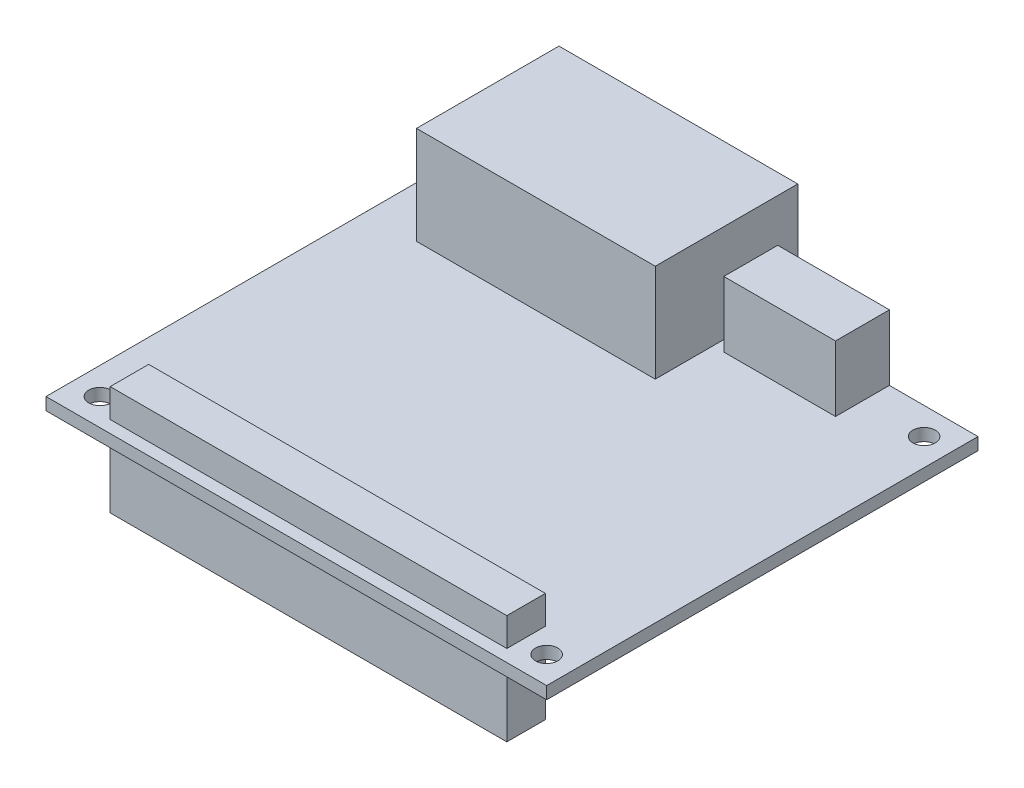
ISO-10303-21;
HEADER;
FILE_DESCRIPTION(('STEP AP214'),'2;1');
FILE_NAME('part.step','',(''),(''),'','','');
FILE_SCHEMA(('AUTOMOTIVE_DESIGN { 1 0 10303 214 1 1 1 1 }'));
ENDSEC;
DATA;
#1=APPLICATION_CONTEXT('core data for automotive mechanical design processes');
#2=APPLICATION_PROTOCOL_DEFINITION('international standard','automotive_design',2000,#1);
#3=PRODUCT_CONTEXT('',#1,'mechanical');
#4=PRODUCT('Part','Part','',(#3));
#5=PRODUCT_RELATED_PRODUCT_CATEGORY('part','',(#4));
#6=PRODUCT_DEFINITION_FORMATION('','',#4);
#7=PRODUCT_DEFINITION_CONTEXT('part definition',#1,'design');
#8=PRODUCT_DEFINITION('design','',#6,#7);
#9=PRODUCT_DEFINITION_SHAPE('','',#8);
#10=(LENGTH_UNIT() NAMED_UNIT(*) SI_UNIT(.MILLI.,.METRE.));
#11=(NAMED_UNIT(*) PLANE_ANGLE_UNIT() SI_UNIT($,.RADIAN.));
#12=(NAMED_UNIT(*) SI_UNIT($,.STERADIAN.) SOLID_ANGLE_UNIT());
#13=UNCERTAINTY_MEASURE_WITH_UNIT(LENGTH_MEASURE(1.E-05),#10,'distance_accuracy_value','');
#14=(GEOMETRIC_REPRESENTATION_CONTEXT(3) GLOBAL_UNCERTAINTY_ASSIGNED_CONTEXT((#13)) GLOBAL_UNIT_ASSIGNED_CONTEXT((#10,
#11,#12)) REPRESENTATION_CONTEXT('',''));
#15=CARTESIAN_POINT('',(0.,0.,0.));
#16=DIRECTION('',(0.,0.,1.));
#17=DIRECTION('',(1.,0.,0.));
#18=AXIS2_PLACEMENT_3D('',#15,#16,#17);
#19=CARTESIAN_POINT('',(-25.75,-8.9,21.4200557958589));
#20=DIRECTION('',(-1.,0.,0.));
#21=DIRECTION('',(0.,0.,1.));
#22=AXIS2_PLACEMENT_3D('',#19,#20,#21);
#23=PLANE('',#22);
#24=DIRECTION('',(0.,1.,0.));
#25=VECTOR('',#24,1.);
#26=CARTESIAN_POINT('',(-25.75,-8.9,26.4200557958589));
#27=LINE('',#26,#25);
#28=CARTESIAN_POINT('',(-25.75,-8.9,26.4200557958589));
#29=VERTEX_POINT('',#28);
#30=CARTESIAN_POINT('',(-25.75,5.3,26.4200557958589));
#31=VERTEX_POINT('',#30);
#32=EDGE_CURVE('E46',#29,#31,#27,.T.);
#33=ORIENTED_EDGE('',*,*,#32,.T.);
#34=DIRECTION('',(0.,0.,1.));
#35=VECTOR('',#34,1.);
#36=CARTESIAN_POINT('',(-25.75,5.3,21.4200557958589));
#37=LINE('',#36,#35);
#38=CARTESIAN_POINT('',(-25.75,5.3,21.4200557958589));
#39=VERTEX_POINT('',#38);
#40=EDGE_CURVE('E83',#39,#31,#37,.T.);
#41=ORIENTED_EDGE('',*,*,#40,.F.);
#42=DIRECTION('',(0.,1.,0.));
#43=VECTOR('',#42,1.);
#44=CARTESIAN_POINT('',(-25.75,-8.9,21.4200557958589));
#45=LINE('',#44,#43);
#46=CARTESIAN_POINT('',(-25.75,-8.9,21.4200557958589));
#47=VERTEX_POINT('',#46);
#48=EDGE_CURVE('E12',#47,#39,#45,.T.);
#49=ORIENTED_EDGE('',*,*,#48,.F.);
#50=DIRECTION('',(0.,0.,1.));
#51=VECTOR('',#50,1.);
#52=CARTESIAN_POINT('',(-25.75,-8.9,21.4200557958589));
#53=LINE('',#52,#51);
#54=EDGE_CURVE('E84',#47,#29,#53,.T.);
#55=ORIENTED_EDGE('',*,*,#54,.T.);
#56=EDGE_LOOP('',(#33,#41,#49,#55));
#57=FACE_BOUND('',#56,.T.);
#58=ADVANCED_FACE('F43',(#57),#23,.T.);
#59=CARTESIAN_POINT('',(-25.75,-8.9,21.4200557958589));
#60=DIRECTION('',(0.,0.,-1.));
#61=DIRECTION('',(-1.,0.,0.));
#62=AXIS2_PLACEMENT_3D('',#59,#60,#61);
#63=PLANE('',#62);
#64=ORIENTED_EDGE('',*,*,#48,.T.);
#65=DIRECTION('',(-1.,0.,0.));
#66=VECTOR('',#65,1.);
#67=CARTESIAN_POINT('',(-25.75,5.3,21.4200557958589));
#68=LINE('',#67,#66);
#69=CARTESIAN_POINT('',(25.75,5.3,21.4200557958589));
#70=VERTEX_POINT('',#69);
#71=EDGE_CURVE('E100',#70,#39,#68,.T.);
#72=ORIENTED_EDGE('',*,*,#71,.F.);
#73=DIRECTION('',(0.,1.,0.));
#74=VECTOR('',#73,1.);
#75=CARTESIAN_POINT('',(25.75,-8.9,21.4200557958589));
#76=LINE('',#75,#74);
#77=CARTESIAN_POINT('',(25.75,-8.9,21.4200557958589));
#78=VERTEX_POINT('',#77);
#79=EDGE_CURVE('E51',#78,#70,#76,.T.);
#80=ORIENTED_EDGE('',*,*,#79,.F.);
#81=DIRECTION('',(-1.,0.,0.));
#82=VECTOR('',#81,1.);
#83=CARTESIAN_POINT('',(-25.75,-8.9,21.4200557958589));
#84=LINE('',#83,#82);
#85=EDGE_CURVE('E89',#78,#47,#84,.T.);
#86=ORIENTED_EDGE('',*,*,#85,.T.);
#87=EDGE_LOOP('',(#64,#72,#80,#86));
#88=FACE_BOUND('',#87,.T.);
#89=ADVANCED_FACE('F115',(#88),#63,.T.);
#90=CARTESIAN_POINT('',(25.75,-8.9,21.4200557958589));
#91=DIRECTION('',(1.,0.,0.));
#92=DIRECTION('',(0.,0.,-1.));
#93=AXIS2_PLACEMENT_3D('',#90,#91,#92);
#94=PLANE('',#93);
#95=ORIENTED_EDGE('',*,*,#79,.T.);
#96=DIRECTION('',(0.,0.,-1.));
#97=VECTOR('',#96,1.);
#98=CARTESIAN_POINT('',(25.75,5.3,21.4200557958589));
#99=LINE('',#98,#97);
#100=CARTESIAN_POINT('',(25.75,5.3,26.4200557958589));
#101=VERTEX_POINT('',#100);
#102=EDGE_CURVE('E96',#101,#70,#99,.T.);
#103=ORIENTED_EDGE('',*,*,#102,.F.);
#104=DIRECTION('',(0.,1.,0.));
#105=VECTOR('',#104,1.);
#106=CARTESIAN_POINT('',(25.75,-8.9,26.4200557958589));
#107=LINE('',#106,#105);
#108=CARTESIAN_POINT('',(25.75,-8.9,26.4200557958589));
#109=VERTEX_POINT('',#108);
#110=EDGE_CURVE('E88',#109,#101,#107,.T.);
#111=ORIENTED_EDGE('',*,*,#110,.F.);
#112=DIRECTION('',(0.,0.,-1.));
#113=VECTOR('',#112,1.);
#114=CARTESIAN_POINT('',(25.75,-8.9,21.4200557958589));
#115=LINE('',#114,#113);
#116=EDGE_CURVE('E108',#109,#78,#115,.T.);
#117=ORIENTED_EDGE('',*,*,#116,.T.);
#118=EDGE_LOOP('',(#95,#103,#111,#117));
#119=FACE_BOUND('',#118,.T.);
#120=ADVANCED_FACE('F112',(#119),#94,.T.);
#121=CARTESIAN_POINT('',(-25.75,-8.9,26.4200557958589));
#122=DIRECTION('',(0.,0.,1.));
#123=DIRECTION('',(1.,0.,0.));
#124=AXIS2_PLACEMENT_3D('',#121,#122,#123);
#125=PLANE('',#124);
#126=ORIENTED_EDGE('',*,*,#110,.T.);
#127=DIRECTION('',(1.,0.,0.));
#128=VECTOR('',#127,1.);
#129=CARTESIAN_POINT('',(-25.75,5.3,26.4200557958589));
#130=LINE('',#129,#128);
#131=EDGE_CURVE('E91',#31,#101,#130,.T.);
#132=ORIENTED_EDGE('',*,*,#131,.F.);
#133=ORIENTED_EDGE('',*,*,#32,.F.);
#134=DIRECTION('',(1.,0.,0.));
#135=VECTOR('',#134,1.);
#136=CARTESIAN_POINT('',(-25.75,-8.9,26.4200557958589));
#137=LINE('',#136,#135);
#138=EDGE_CURVE('E106',#29,#109,#137,.T.);
#139=ORIENTED_EDGE('',*,*,#138,.T.);
#140=EDGE_LOOP('',(#126,#132,#133,#139));
#141=FACE_BOUND('',#140,.T.);
#142=ADVANCED_FACE('F92',(#141),#125,.T.);
#143=CARTESIAN_POINT('',(0.,-8.9,0.));
#144=DIRECTION('',(0.,1.,0.));
#145=DIRECTION('',(0.,0.,1.));
#146=AXIS2_PLACEMENT_3D('',#143,#144,#145);
#147=PLANE('',#146);
#148=ORIENTED_EDGE('',*,*,#54,.F.);
#149=ORIENTED_EDGE('',*,*,#85,.F.);
#150=ORIENTED_EDGE('',*,*,#116,.F.);
#151=ORIENTED_EDGE('',*,*,#138,.F.);
#152=EDGE_LOOP('',(#148,#149,#150,#151));
#153=FACE_BOUND('',#152,.T.);
#154=ADVANCED_FACE('F117',(#153),#147,.F.);
#155=CARTESIAN_POINT('',(0.,5.3,0.));
#156=DIRECTION('',(0.,1.,0.));
#157=DIRECTION('',(0.,0.,1.));
#158=AXIS2_PLACEMENT_3D('',#155,#156,#157);
#159=PLANE('',#158);
#160=ORIENTED_EDGE('',*,*,#40,.T.);
#161=ORIENTED_EDGE('',*,*,#131,.T.);
#162=ORIENTED_EDGE('',*,*,#102,.T.);
#163=ORIENTED_EDGE('',*,*,#71,.T.);
#164=EDGE_LOOP('',(#160,#161,#162,#163));
#165=FACE_BOUND('',#164,.T.);
#166=ADVANCED_FACE('F99',(#165),#159,.T.);
#167=CLOSED_SHELL('',(#58,#89,#120,#142,#154,#166));
#168=MANIFOLD_SOLID_BREP('B2',#167);
#169=CARTESIAN_POINT('',(6.49999999999999,10.1,-28.));
#170=DIRECTION('',(1.,0.,0.));
#171=DIRECTION('',(0.,0.,-1.));
#172=AXIS2_PLACEMENT_3D('',#169,#170,#171);
#173=PLANE('',#172);
#174=DIRECTION('',(0.,0.,1.));
#175=VECTOR('',#174,1.);
#176=CARTESIAN_POINT('',(6.49999999999999,1.6,-28.));
#177=LINE('',#176,#175);
#178=CARTESIAN_POINT('',(6.49999999999999,1.6,-28.));
#179=VERTEX_POINT('',#178);
#180=CARTESIAN_POINT('',(6.49999999999999,1.6,-21.));
#181=VERTEX_POINT('',#180);
#182=EDGE_CURVE('E239',#179,#181,#177,.T.);
#183=ORIENTED_EDGE('',*,*,#182,.T.);
#184=DIRECTION('',(0.,-1.,0.));
#185=VECTOR('',#184,1.);
#186=CARTESIAN_POINT('',(6.49999999999999,10.1,-21.));
#187=LINE('',#186,#185);
#188=CARTESIAN_POINT('',(6.49999999999999,10.1,-21.));
#189=VERTEX_POINT('',#188);
#190=EDGE_CURVE('E41',#189,#181,#187,.T.);
#191=ORIENTED_EDGE('',*,*,#190,.F.);
#192=DIRECTION('',(0.,0.,1.));
#193=VECTOR('',#192,1.);
#194=CARTESIAN_POINT('',(6.49999999999999,10.1,-28.));
#195=LINE('',#194,#193);
#196=CARTESIAN_POINT('',(6.49999999999999,10.1,-28.));
#197=VERTEX_POINT('',#196);
#198=EDGE_CURVE('E227',#197,#189,#195,.T.);
#199=ORIENTED_EDGE('',*,*,#198,.F.);
#200=DIRECTION('',(0.,-1.,0.));
#201=VECTOR('',#200,1.);
#202=CARTESIAN_POINT('',(6.49999999999999,10.1,-28.));
#203=LINE('',#202,#201);
#204=EDGE_CURVE('E235',#197,#179,#203,.T.);
#205=ORIENTED_EDGE('',*,*,#204,.T.);
#206=EDGE_LOOP('',(#183,#191,#199,#205));
#207=FACE_BOUND('',#206,.T.);
#208=ADVANCED_FACE('F176',(#207),#173,.F.);
#209=CARTESIAN_POINT('',(6.49999999999999,10.1,-21.));
#210=DIRECTION('',(0.,0.,-1.));
#211=DIRECTION('',(-1.,0.,0.));
#212=AXIS2_PLACEMENT_3D('',#209,#210,#211);
#213=PLANE('',#212);
#214=DIRECTION('',(1.,0.,0.));
#215=VECTOR('',#214,1.);
#216=CARTESIAN_POINT('',(6.49999999999999,1.6,-21.));
#217=LINE('',#216,#215);
#218=CARTESIAN_POINT('',(21.,1.6,-21.));
#219=VERTEX_POINT('',#218);
#220=EDGE_CURVE('E231',#181,#219,#217,.T.);
#221=ORIENTED_EDGE('',*,*,#220,.T.);
#222=DIRECTION('',(0.,-1.,0.));
#223=VECTOR('',#222,1.);
#224=CARTESIAN_POINT('',(21.,10.1,-21.));
#225=LINE('',#224,#223);
#226=CARTESIAN_POINT('',(21.,10.1,-21.));
#227=VERTEX_POINT('',#226);
#228=EDGE_CURVE('E184',#227,#219,#225,.T.);
#229=ORIENTED_EDGE('',*,*,#228,.F.);
#230=DIRECTION('',(1.,0.,0.));
#231=VECTOR('',#230,1.);
#232=CARTESIAN_POINT('',(6.49999999999999,10.1,-21.));
#233=LINE('',#232,#231);
#234=EDGE_CURVE('E222',#189,#227,#233,.T.);
#235=ORIENTED_EDGE('',*,*,#234,.F.);
#236=ORIENTED_EDGE('',*,*,#190,.T.);
#237=EDGE_LOOP('',(#221,#229,#235,#236));
#238=FACE_BOUND('',#237,.T.);
#239=ADVANCED_FACE('F230',(#238),#213,.F.);
#240=CARTESIAN_POINT('',(21.,10.1,-28.));
#241=DIRECTION('',(-1.,0.,0.));
#242=DIRECTION('',(0.,0.,1.));
#243=AXIS2_PLACEMENT_3D('',#240,#241,#242);
#244=PLANE('',#243);
#245=DIRECTION('',(0.,0.,-1.));
#246=VECTOR('',#245,1.);
#247=CARTESIAN_POINT('',(21.,1.6,-28.));
#248=LINE('',#247,#246);
#249=CARTESIAN_POINT('',(21.,1.6,-28.));
#250=VERTEX_POINT('',#249);
#251=EDGE_CURVE('E209',#219,#250,#248,.T.);
#252=ORIENTED_EDGE('',*,*,#251,.T.);
#253=DIRECTION('',(0.,-1.,0.));
#254=VECTOR('',#253,1.);
#255=CARTESIAN_POINT('',(21.,10.1,-28.));
#256=LINE('',#255,#254);
#257=CARTESIAN_POINT('',(21.,10.1,-28.));
#258=VERTEX_POINT('',#257);
#259=EDGE_CURVE('E232',#258,#250,#256,.T.);
#260=ORIENTED_EDGE('',*,*,#259,.F.);
#261=DIRECTION('',(0.,0.,-1.));
#262=VECTOR('',#261,1.);
#263=CARTESIAN_POINT('',(21.,10.1,-28.));
#264=LINE('',#263,#262);
#265=EDGE_CURVE('E225',#227,#258,#264,.T.);
#266=ORIENTED_EDGE('',*,*,#265,.F.);
#267=ORIENTED_EDGE('',*,*,#228,.T.);
#268=EDGE_LOOP('',(#252,#260,#266,#267));
#269=FACE_BOUND('',#268,.T.);
#270=ADVANCED_FACE('F233',(#269),#244,.F.);
#271=CARTESIAN_POINT('',(6.49999999999999,10.1,-28.));
#272=DIRECTION('',(0.,0.,1.));
#273=DIRECTION('',(1.,0.,0.));
#274=AXIS2_PLACEMENT_3D('',#271,#272,#273);
#275=PLANE('',#274);
#276=DIRECTION('',(-1.,0.,0.));
#277=VECTOR('',#276,1.);
#278=CARTESIAN_POINT('',(6.49999999999999,1.6,-28.));
#279=LINE('',#278,#277);
#280=EDGE_CURVE('E215',#250,#179,#279,.T.);
#281=ORIENTED_EDGE('',*,*,#280,.T.);
#282=ORIENTED_EDGE('',*,*,#204,.F.);
#283=DIRECTION('',(-1.,0.,0.));
#284=VECTOR('',#283,1.);
#285=CARTESIAN_POINT('',(6.49999999999999,10.1,-28.));
#286=LINE('',#285,#284);
#287=EDGE_CURVE('E192',#258,#197,#286,.T.);
#288=ORIENTED_EDGE('',*,*,#287,.F.);
#289=ORIENTED_EDGE('',*,*,#259,.T.);
#290=EDGE_LOOP('',(#281,#282,#288,#289));
#291=FACE_BOUND('',#290,.T.);
#292=ADVANCED_FACE('F246',(#291),#275,.F.);
#293=CARTESIAN_POINT('',(0.,10.1,0.));
#294=DIRECTION('',(0.,1.,0.));
#295=DIRECTION('',(0.,0.,1.));
#296=AXIS2_PLACEMENT_3D('',#293,#294,#295);
#297=PLANE('',#296);
#298=ORIENTED_EDGE('',*,*,#198,.T.);
#299=ORIENTED_EDGE('',*,*,#234,.T.);
#300=ORIENTED_EDGE('',*,*,#265,.T.);
#301=ORIENTED_EDGE('',*,*,#287,.T.);
#302=EDGE_LOOP('',(#298,#299,#300,#301));
#303=FACE_BOUND('',#302,.T.);
#304=ADVANCED_FACE('F223',(#303),#297,.T.);
#305=CARTESIAN_POINT('',(0.,1.6,0.));
#306=DIRECTION('',(0.,1.,0.));
#307=DIRECTION('',(0.,0.,1.));
#308=AXIS2_PLACEMENT_3D('',#305,#306,#307);
#309=PLANE('',#308);
#310=ORIENTED_EDGE('',*,*,#182,.F.);
#311=ORIENTED_EDGE('',*,*,#280,.F.);
#312=ORIENTED_EDGE('',*,*,#251,.F.);
#313=ORIENTED_EDGE('',*,*,#220,.F.);
#314=EDGE_LOOP('',(#310,#311,#312,#313));
#315=FACE_BOUND('',#314,.T.);
#316=ADVANCED_FACE('F249',(#315),#309,.F.);
#317=CLOSED_SHELL('',(#208,#239,#270,#292,#304,#316));
#318=MANIFOLD_SOLID_BREP('B6',#317);
#319=CARTESIAN_POINT('',(-25.9,14.3,-32.));
#320=DIRECTION('',(1.,0.,0.));
#321=DIRECTION('',(0.,0.,-1.));
#322=AXIS2_PLACEMENT_3D('',#319,#320,#321);
#323=PLANE('',#322);
#324=DIRECTION('',(0.,0.,1.));
#325=VECTOR('',#324,1.);
#326=CARTESIAN_POINT('',(-25.9,1.6,-32.));
#327=LINE('',#326,#325);
#328=CARTESIAN_POINT('',(-25.9,1.6,-32.));
#329=VERTEX_POINT('',#328);
#330=CARTESIAN_POINT('',(-25.9,1.6,-13.5));
#331=VERTEX_POINT('',#330);
#332=EDGE_CURVE('E371',#329,#331,#327,.T.);
#333=ORIENTED_EDGE('',*,*,#332,.T.);
#334=DIRECTION('',(0.,-1.,0.));
#335=VECTOR('',#334,1.);
#336=CARTESIAN_POINT('',(-25.9,14.3,-13.5));
#337=LINE('',#336,#335);
#338=CARTESIAN_POINT('',(-25.9,14.3,-13.5));
#339=VERTEX_POINT('',#338);
#340=EDGE_CURVE('E174',#339,#331,#337,.T.);
#341=ORIENTED_EDGE('',*,*,#340,.F.);
#342=DIRECTION('',(0.,0.,1.));
#343=VECTOR('',#342,1.);
#344=CARTESIAN_POINT('',(-25.9,14.3,-32.));
#345=LINE('',#344,#343);
#346=CARTESIAN_POINT('',(-25.9,14.3,-32.));
#347=VERTEX_POINT('',#346);
#348=EDGE_CURVE('E359',#347,#339,#345,.T.);
#349=ORIENTED_EDGE('',*,*,#348,.F.);
#350=DIRECTION('',(0.,-1.,0.));
#351=VECTOR('',#350,1.);
#352=CARTESIAN_POINT('',(-25.9,14.3,-32.));
#353=LINE('',#352,#351);
#354=EDGE_CURVE('E367',#347,#329,#353,.T.);
#355=ORIENTED_EDGE('',*,*,#354,.T.);
#356=EDGE_LOOP('',(#333,#341,#349,#355));
#357=FACE_BOUND('',#356,.T.);
#358=ADVANCED_FACE('F308',(#357),#323,.F.);
#359=CARTESIAN_POINT('',(-25.9,14.3,-13.5));
#360=DIRECTION('',(0.,0.,-1.));
#361=DIRECTION('',(-1.,0.,0.));
#362=AXIS2_PLACEMENT_3D('',#359,#360,#361);
#363=PLANE('',#362);
#364=DIRECTION('',(1.,0.,0.));
#365=VECTOR('',#364,1.);
#366=CARTESIAN_POINT('',(-25.9,1.6,-13.5));
#367=LINE('',#366,#365);
#368=CARTESIAN_POINT('',(5.1,1.6,-13.5));
#369=VERTEX_POINT('',#368);
#370=EDGE_CURVE('E363',#331,#369,#367,.T.);
#371=ORIENTED_EDGE('',*,*,#370,.T.);
#372=DIRECTION('',(0.,-1.,0.));
#373=VECTOR('',#372,1.);
#374=CARTESIAN_POINT('',(5.1,14.3,-13.5));
#375=LINE('',#374,#373);
#376=CARTESIAN_POINT('',(5.1,14.3,-13.5));
#377=VERTEX_POINT('',#376);
#378=EDGE_CURVE('E316',#377,#369,#375,.T.);
#379=ORIENTED_EDGE('',*,*,#378,.F.);
#380=DIRECTION('',(1.,0.,0.));
#381=VECTOR('',#380,1.);
#382=CARTESIAN_POINT('',(-25.9,14.3,-13.5));
#383=LINE('',#382,#381);
#384=EDGE_CURVE('E354',#339,#377,#383,.T.);
#385=ORIENTED_EDGE('',*,*,#384,.F.);
#386=ORIENTED_EDGE('',*,*,#340,.T.);
#387=EDGE_LOOP('',(#371,#379,#385,#386));
#388=FACE_BOUND('',#387,.T.);
#389=ADVANCED_FACE('F362',(#388),#363,.F.);
#390=CARTESIAN_POINT('',(5.09999999999999,14.3,-32.));
#391=DIRECTION('',(-1.,0.,0.));
#392=DIRECTION('',(0.,0.,1.));
#393=AXIS2_PLACEMENT_3D('',#390,#391,#392);
#394=PLANE('',#393);
#395=DIRECTION('',(0.,0.,-1.));
#396=VECTOR('',#395,1.);
#397=CARTESIAN_POINT('',(5.09999999999999,1.6,-32.));
#398=LINE('',#397,#396);
#399=CARTESIAN_POINT('',(5.09999999999999,1.6,-32.));
#400=VERTEX_POINT('',#399);
#401=EDGE_CURVE('E341',#369,#400,#398,.T.);
#402=ORIENTED_EDGE('',*,*,#401,.T.);
#403=DIRECTION('',(0.,-1.,0.));
#404=VECTOR('',#403,1.);
#405=CARTESIAN_POINT('',(5.09999999999999,14.3,-32.));
#406=LINE('',#405,#404);
#407=CARTESIAN_POINT('',(5.09999999999999,14.3,-32.));
#408=VERTEX_POINT('',#407);
#409=EDGE_CURVE('E364',#408,#400,#406,.T.);
#410=ORIENTED_EDGE('',*,*,#409,.F.);
#411=DIRECTION('',(0.,0.,-1.));
#412=VECTOR('',#411,1.);
#413=CARTESIAN_POINT('',(5.09999999999999,14.3,-32.));
#414=LINE('',#413,#412);
#415=EDGE_CURVE('E357',#377,#408,#414,.T.);
#416=ORIENTED_EDGE('',*,*,#415,.F.);
#417=ORIENTED_EDGE('',*,*,#378,.T.);
#418=EDGE_LOOP('',(#402,#410,#416,#417));
#419=FACE_BOUND('',#418,.T.);
#420=ADVANCED_FACE('F365',(#419),#394,.F.);
#421=CARTESIAN_POINT('',(-25.9,14.3,-32.));
#422=DIRECTION('',(0.,0.,1.));
#423=DIRECTION('',(1.,0.,0.));
#424=AXIS2_PLACEMENT_3D('',#421,#422,#423);
#425=PLANE('',#424);
#426=DIRECTION('',(-1.,0.,0.));
#427=VECTOR('',#426,1.);
#428=CARTESIAN_POINT('',(-25.9,1.6,-32.));
#429=LINE('',#428,#427);
#430=EDGE_CURVE('E347',#400,#329,#429,.T.);
#431=ORIENTED_EDGE('',*,*,#430,.T.);
#432=ORIENTED_EDGE('',*,*,#354,.F.);
#433=DIRECTION('',(-1.,0.,0.));
#434=VECTOR('',#433,1.);
#435=CARTESIAN_POINT('',(-25.9,14.3,-32.));
#436=LINE('',#435,#434);
#437=EDGE_CURVE('E324',#408,#347,#436,.T.);
#438=ORIENTED_EDGE('',*,*,#437,.F.);
#439=ORIENTED_EDGE('',*,*,#409,.T.);
#440=EDGE_LOOP('',(#431,#432,#438,#439));
#441=FACE_BOUND('',#440,.T.);
#442=ADVANCED_FACE('F378',(#441),#425,.F.);
#443=CARTESIAN_POINT('',(0.,14.3,0.));
#444=DIRECTION('',(0.,1.,0.));
#445=DIRECTION('',(0.,0.,1.));
#446=AXIS2_PLACEMENT_3D('',#443,#444,#445);
#447=PLANE('',#446);
#448=ORIENTED_EDGE('',*,*,#348,.T.);
#449=ORIENTED_EDGE('',*,*,#384,.T.);
#450=ORIENTED_EDGE('',*,*,#415,.T.);
#451=ORIENTED_EDGE('',*,*,#437,.T.);
#452=EDGE_LOOP('',(#448,#449,#450,#451));
#453=FACE_BOUND('',#452,.T.);
#454=ADVANCED_FACE('F355',(#453),#447,.T.);
#455=CARTESIAN_POINT('',(0.,1.6,0.));
#456=DIRECTION('',(0.,1.,0.));
#457=DIRECTION('',(0.,0.,1.));
#458=AXIS2_PLACEMENT_3D('',#455,#456,#457);
#459=PLANE('',#458);
#460=ORIENTED_EDGE('',*,*,#332,.F.);
#461=ORIENTED_EDGE('',*,*,#430,.F.);
#462=ORIENTED_EDGE('',*,*,#401,.F.);
#463=ORIENTED_EDGE('',*,*,#370,.F.);
#464=EDGE_LOOP('',(#460,#461,#462,#463));
#465=FACE_BOUND('',#464,.T.);
#466=ADVANCED_FACE('F381',(#465),#459,.F.);
#467=CLOSED_SHELL('',(#358,#389,#420,#442,#454,#466));
#468=MANIFOLD_SOLID_BREP('B35',#467);
#469=CARTESIAN_POINT('',(-32.5,1.6,-28.));
#470=DIRECTION('',(1.,0.,0.));
#471=DIRECTION('',(0.,0.,-1.));
#472=AXIS2_PLACEMENT_3D('',#469,#470,#471);
#473=PLANE('',#472);
#474=DIRECTION('',(0.,0.,1.));
#475=VECTOR('',#474,1.);
#476=CARTESIAN_POINT('',(-32.5,0.,-28.));
#477=LINE('',#476,#475);
#478=CARTESIAN_POINT('',(-32.5,0.,-28.));
#479=VERTEX_POINT('',#478);
#480=CARTESIAN_POINT('',(-32.5,0.,28.));
#481=VERTEX_POINT('',#480);
#482=EDGE_CURVE('E494',#479,#481,#477,.T.);
#483=ORIENTED_EDGE('',*,*,#482,.T.);
#484=DIRECTION('',(0.,-1.,0.));
#485=VECTOR('',#484,1.);
#486=CARTESIAN_POINT('',(-32.5,1.6,28.));
#487=LINE('',#486,#485);
#488=CARTESIAN_POINT('',(-32.5,1.6,28.));
#489=VERTEX_POINT('',#488);
#490=EDGE_CURVE('E306',#489,#481,#487,.T.);
#491=ORIENTED_EDGE('',*,*,#490,.F.);
#492=DIRECTION('',(0.,0.,1.));
#493=VECTOR('',#492,1.);
#494=CARTESIAN_POINT('',(-32.5,1.6,-28.));
#495=LINE('',#494,#493);
#496=CARTESIAN_POINT('',(-32.5,1.6,-28.));
#497=VERTEX_POINT('',#496);
#498=EDGE_CURVE('E482',#497,#489,#495,.T.);
#499=ORIENTED_EDGE('',*,*,#498,.F.);
#500=DIRECTION('',(0.,-1.,0.));
#501=VECTOR('',#500,1.);
#502=CARTESIAN_POINT('',(-32.5,1.6,-28.));
#503=LINE('',#502,#501);
#504=EDGE_CURVE('E490',#497,#479,#503,.T.);
#505=ORIENTED_EDGE('',*,*,#504,.T.);
#506=EDGE_LOOP('',(#483,#491,#499,#505));
#507=FACE_BOUND('',#506,.T.);
#508=ADVANCED_FACE('F431',(#507),#473,.F.);
#509=CARTESIAN_POINT('',(-32.5,1.6,28.));
#510=DIRECTION('',(0.,0.,-1.));
#511=DIRECTION('',(-1.,0.,0.));
#512=AXIS2_PLACEMENT_3D('',#509,#510,#511);
#513=PLANE('',#512);
#514=DIRECTION('',(1.,0.,0.));
#515=VECTOR('',#514,1.);
#516=CARTESIAN_POINT('',(-32.5,0.,28.));
#517=LINE('',#516,#515);
#518=CARTESIAN_POINT('',(32.5,0.,28.));
#519=VERTEX_POINT('',#518);
#520=EDGE_CURVE('E486',#481,#519,#517,.T.);
#521=ORIENTED_EDGE('',*,*,#520,.T.);
#522=DIRECTION('',(0.,-1.,0.));
#523=VECTOR('',#522,1.);
#524=CARTESIAN_POINT('',(32.5,1.6,28.));
#525=LINE('',#524,#523);
#526=CARTESIAN_POINT('',(32.5,1.6,28.));
#527=VERTEX_POINT('',#526);
#528=EDGE_CURVE('E439',#527,#519,#525,.T.);
#529=ORIENTED_EDGE('',*,*,#528,.F.);
#530=DIRECTION('',(1.,0.,0.));
#531=VECTOR('',#530,1.);
#532=CARTESIAN_POINT('',(-32.5,1.6,28.));
#533=LINE('',#532,#531);
#534=EDGE_CURVE('E477',#489,#527,#533,.T.);
#535=ORIENTED_EDGE('',*,*,#534,.F.);
#536=ORIENTED_EDGE('',*,*,#490,.T.);
#537=EDGE_LOOP('',(#521,#529,#535,#536));
#538=FACE_BOUND('',#537,.T.);
#539=ADVANCED_FACE('F485',(#538),#513,.F.);
#540=CARTESIAN_POINT('',(32.5,1.6,-28.));
#541=DIRECTION('',(-1.,0.,0.));
#542=DIRECTION('',(0.,0.,1.));
#543=AXIS2_PLACEMENT_3D('',#540,#541,#542);
#544=PLANE('',#543);
#545=DIRECTION('',(0.,0.,-1.));
#546=VECTOR('',#545,1.);
#547=CARTESIAN_POINT('',(32.5,0.,-28.));
#548=LINE('',#547,#546);
#549=CARTESIAN_POINT('',(32.5,0.,-28.));
#550=VERTEX_POINT('',#549);
#551=EDGE_CURVE('E464',#519,#550,#548,.T.);
#552=ORIENTED_EDGE('',*,*,#551,.T.);
#553=DIRECTION('',(0.,-1.,0.));
#554=VECTOR('',#553,1.);
#555=CARTESIAN_POINT('',(32.5,1.6,-28.));
#556=LINE('',#555,#554);
#557=CARTESIAN_POINT('',(32.5,1.6,-28.));
#558=VERTEX_POINT('',#557);
#559=EDGE_CURVE('E487',#558,#550,#556,.T.);
#560=ORIENTED_EDGE('',*,*,#559,.F.);
#561=DIRECTION('',(0.,0.,-1.));
#562=VECTOR('',#561,1.);
#563=CARTESIAN_POINT('',(32.5,1.6,-28.));
#564=LINE('',#563,#562);
#565=EDGE_CURVE('E480',#527,#558,#564,.T.);
#566=ORIENTED_EDGE('',*,*,#565,.F.);
#567=ORIENTED_EDGE('',*,*,#528,.T.);
#568=EDGE_LOOP('',(#552,#560,#566,#567));
#569=FACE_BOUND('',#568,.T.);
#570=ADVANCED_FACE('F488',(#569),#544,.F.);
#571=CARTESIAN_POINT('',(-32.5,1.6,-28.));
#572=DIRECTION('',(0.,0.,1.));
#573=DIRECTION('',(1.,0.,0.));
#574=AXIS2_PLACEMENT_3D('',#571,#572,#573);
#575=PLANE('',#574);
#576=DIRECTION('',(-1.,0.,0.));
#577=VECTOR('',#576,1.);
#578=CARTESIAN_POINT('',(-32.5,0.,-28.));
#579=LINE('',#578,#577);
#580=EDGE_CURVE('E470',#550,#479,#579,.T.);
#581=ORIENTED_EDGE('',*,*,#580,.T.);
#582=ORIENTED_EDGE('',*,*,#504,.F.);
#583=DIRECTION('',(-1.,0.,0.));
#584=VECTOR('',#583,1.);
#585=CARTESIAN_POINT('',(-32.5,1.6,-28.));
#586=LINE('',#585,#584);
#587=EDGE_CURVE('E447',#558,#497,#586,.T.);
#588=ORIENTED_EDGE('',*,*,#587,.F.);
#589=ORIENTED_EDGE('',*,*,#559,.T.);
#590=EDGE_LOOP('',(#581,#582,#588,#589));
#591=FACE_BOUND('',#590,.T.);
#592=ADVANCED_FACE('F502',(#591),#575,.F.);
#593=CARTESIAN_POINT('',(0.,1.6,0.));
#594=DIRECTION('',(0.,1.,0.));
#595=DIRECTION('',(0.,0.,1.));
#596=AXIS2_PLACEMENT_3D('',#593,#594,#595);
#597=PLANE('',#596);
#598=CARTESIAN_POINT('',(-29.,1.6,-24.5));
#599=DIRECTION('',(0.,1.,0.));
#600=DIRECTION('',(0.,0.,1.));
#601=AXIS2_PLACEMENT_3D('',#598,#599,#600);
#602=CIRCLE('',#601,1.44999999999999);
#603=CARTESIAN_POINT('',(-29.,1.6,-23.05));
#604=VERTEX_POINT('',#603);
#605=EDGE_CURVE('E528',#604,#604,#602,.T.);
#606=ORIENTED_EDGE('',*,*,#605,.F.);
#607=EDGE_LOOP('',(#606));
#608=FACE_BOUND('',#607,.T.);
#609=CARTESIAN_POINT('',(29.,1.6,-24.5));
#610=DIRECTION('',(0.,1.,0.));
#611=DIRECTION('',(0.,0.,1.));
#612=AXIS2_PLACEMENT_3D('',#609,#610,#611);
#613=CIRCLE('',#612,1.44999999999999);
#614=CARTESIAN_POINT('',(29.,1.6,-23.05));
#615=VERTEX_POINT('',#614);
#616=EDGE_CURVE('E522',#615,#615,#613,.T.);
#617=ORIENTED_EDGE('',*,*,#616,.F.);
#618=EDGE_LOOP('',(#617));
#619=FACE_BOUND('',#618,.T.);
#620=CARTESIAN_POINT('',(29.,1.6,24.5));
#621=DIRECTION('',(0.,1.,0.));
#622=DIRECTION('',(0.,0.,1.));
#623=AXIS2_PLACEMENT_3D('',#620,#621,#622);
#624=CIRCLE('',#623,1.44999999999999);
#625=CARTESIAN_POINT('',(29.,1.6,25.95));
#626=VERTEX_POINT('',#625);
#627=EDGE_CURVE('E516',#626,#626,#624,.T.);
#628=ORIENTED_EDGE('',*,*,#627,.F.);
#629=EDGE_LOOP('',(#628));
#630=FACE_BOUND('',#629,.T.);
#631=CARTESIAN_POINT('',(-29.,1.6,24.5));
#632=DIRECTION('',(0.,1.,0.));
#633=DIRECTION('',(0.,0.,1.));
#634=AXIS2_PLACEMENT_3D('',#631,#632,#633);
#635=CIRCLE('',#634,1.44999999999999);
#636=CARTESIAN_POINT('',(-29.,1.6,25.95));
#637=VERTEX_POINT('',#636);
#638=EDGE_CURVE('E510',#637,#637,#635,.T.);
#639=ORIENTED_EDGE('',*,*,#638,.F.);
#640=EDGE_LOOP('',(#639));
#641=FACE_BOUND('',#640,.T.);
#642=ORIENTED_EDGE('',*,*,#498,.T.);
#643=ORIENTED_EDGE('',*,*,#534,.T.);
#644=ORIENTED_EDGE('',*,*,#565,.T.);
#645=ORIENTED_EDGE('',*,*,#587,.T.);
#646=EDGE_LOOP('',(#642,#643,#644,#645));
#647=FACE_BOUND('',#646,.T.);
#648=ADVANCED_FACE('F478',(#608,#619,#630,#641,#647),#597,.T.);
#649=CARTESIAN_POINT('',(0.,0.,0.));
#650=DIRECTION('',(0.,1.,0.));
#651=DIRECTION('',(0.,0.,1.));
#652=AXIS2_PLACEMENT_3D('',#649,#650,#651);
#653=PLANE('',#652);
#654=CARTESIAN_POINT('',(-29.,0.,-24.5));
#655=DIRECTION('',(0.,1.,0.));
#656=DIRECTION('',(0.,0.,1.));
#657=AXIS2_PLACEMENT_3D('',#654,#655,#656);
#658=CIRCLE('',#657,1.45);
#659=CARTESIAN_POINT('',(-29.,0.,-23.05));
#660=VERTEX_POINT('',#659);
#661=EDGE_CURVE('E525',#660,#660,#658,.T.);
#662=ORIENTED_EDGE('',*,*,#661,.T.);
#663=EDGE_LOOP('',(#662));
#664=FACE_BOUND('',#663,.T.);
#665=CARTESIAN_POINT('',(29.,0.,-24.5));
#666=DIRECTION('',(0.,1.,0.));
#667=DIRECTION('',(0.,0.,1.));
#668=AXIS2_PLACEMENT_3D('',#665,#666,#667);
#669=CIRCLE('',#668,1.45);
#670=CARTESIAN_POINT('',(29.,0.,-23.05));
#671=VERTEX_POINT('',#670);
#672=EDGE_CURVE('E519',#671,#671,#669,.T.);
#673=ORIENTED_EDGE('',*,*,#672,.T.);
#674=EDGE_LOOP('',(#673));
#675=FACE_BOUND('',#674,.T.);
#676=CARTESIAN_POINT('',(29.,0.,24.5));
#677=DIRECTION('',(0.,1.,0.));
#678=DIRECTION('',(0.,0.,1.));
#679=AXIS2_PLACEMENT_3D('',#676,#677,#678);
#680=CIRCLE('',#679,1.45);
#681=CARTESIAN_POINT('',(29.,0.,25.95));
#682=VERTEX_POINT('',#681);
#683=EDGE_CURVE('E513',#682,#682,#680,.T.);
#684=ORIENTED_EDGE('',*,*,#683,.T.);
#685=EDGE_LOOP('',(#684));
#686=FACE_BOUND('',#685,.T.);
#687=CARTESIAN_POINT('',(-29.,0.,24.5));
#688=DIRECTION('',(0.,1.,0.));
#689=DIRECTION('',(0.,0.,1.));
#690=AXIS2_PLACEMENT_3D('',#687,#688,#689);
#691=CIRCLE('',#690,1.45);
#692=CARTESIAN_POINT('',(-29.,0.,25.95));
#693=VERTEX_POINT('',#692);
#694=EDGE_CURVE('E497',#693,#693,#691,.T.);
#695=ORIENTED_EDGE('',*,*,#694,.T.);
#696=EDGE_LOOP('',(#695));
#697=FACE_BOUND('',#696,.T.);
#698=ORIENTED_EDGE('',*,*,#482,.F.);
#699=ORIENTED_EDGE('',*,*,#580,.F.);
#700=ORIENTED_EDGE('',*,*,#551,.F.);
#701=ORIENTED_EDGE('',*,*,#520,.F.);
#702=EDGE_LOOP('',(#698,#699,#700,#701));
#703=FACE_BOUND('',#702,.T.);
#704=ADVANCED_FACE('F505',(#664,#675,#686,#697,#703),#653,.F.);
#705=CARTESIAN_POINT('',(-29.,1.6,24.5));
#706=DIRECTION('',(0.,1.,0.));
#707=DIRECTION('',(0.,0.,1.));
#708=AXIS2_PLACEMENT_3D('',#705,#706,#707);
#709=CYLINDRICAL_SURFACE('',#708,1.44999999999999);
#710=ORIENTED_EDGE('',*,*,#694,.F.);
#711=EDGE_LOOP('',(#710));
#712=FACE_BOUND('',#711,.T.);
#713=ORIENTED_EDGE('',*,*,#638,.T.);
#714=EDGE_LOOP('',(#713));
#715=FACE_BOUND('',#714,.T.);
#716=ADVANCED_FACE('F543',(#712,#715),#709,.F.);
#717=CARTESIAN_POINT('',(29.,1.6,24.5));
#718=DIRECTION('',(0.,1.,0.));
#719=DIRECTION('',(0.,0.,1.));
#720=AXIS2_PLACEMENT_3D('',#717,#718,#719);
#721=CYLINDRICAL_SURFACE('',#720,1.44999999999999);
#722=ORIENTED_EDGE('',*,*,#683,.F.);
#723=EDGE_LOOP('',(#722));
#724=FACE_BOUND('',#723,.T.);
#725=ORIENTED_EDGE('',*,*,#627,.T.);
#726=EDGE_LOOP('',(#725));
#727=FACE_BOUND('',#726,.T.);
#728=ADVANCED_FACE('F545',(#724,#727),#721,.F.);
#729=CARTESIAN_POINT('',(29.,1.6,-24.5));
#730=DIRECTION('',(0.,1.,0.));
#731=DIRECTION('',(0.,0.,1.));
#732=AXIS2_PLACEMENT_3D('',#729,#730,#731);
#733=CYLINDRICAL_SURFACE('',#732,1.44999999999999);
#734=ORIENTED_EDGE('',*,*,#672,.F.);
#735=EDGE_LOOP('',(#734));
#736=FACE_BOUND('',#735,.T.);
#737=ORIENTED_EDGE('',*,*,#616,.T.);
#738=EDGE_LOOP('',(#737));
#739=FACE_BOUND('',#738,.T.);
#740=ADVANCED_FACE('F552',(#736,#739),#733,.F.);
#741=CARTESIAN_POINT('',(-29.,1.6,-24.5));
#742=DIRECTION('',(0.,1.,0.));
#743=DIRECTION('',(0.,0.,1.));
#744=AXIS2_PLACEMENT_3D('',#741,#742,#743);
#745=CYLINDRICAL_SURFACE('',#744,1.44999999999999);
#746=ORIENTED_EDGE('',*,*,#661,.F.);
#747=EDGE_LOOP('',(#746));
#748=FACE_BOUND('',#747,.T.);
#749=ORIENTED_EDGE('',*,*,#605,.T.);
#750=EDGE_LOOP('',(#749));
#751=FACE_BOUND('',#750,.T.);
#752=ADVANCED_FACE('F532',(#748,#751),#745,.F.);
#753=CLOSED_SHELL('',(#508,#539,#570,#592,#648,#704,#716,#728,#740,#752));
#754=MANIFOLD_SOLID_BREP('B168',#753);
#755=ADVANCED_BREP_SHAPE_REPRESENTATION('',(#18,#168,#318,#468,#754),#14);
#756=SHAPE_DEFINITION_REPRESENTATION(#9,#755);
ENDSEC;
END-ISO-10303-21;
